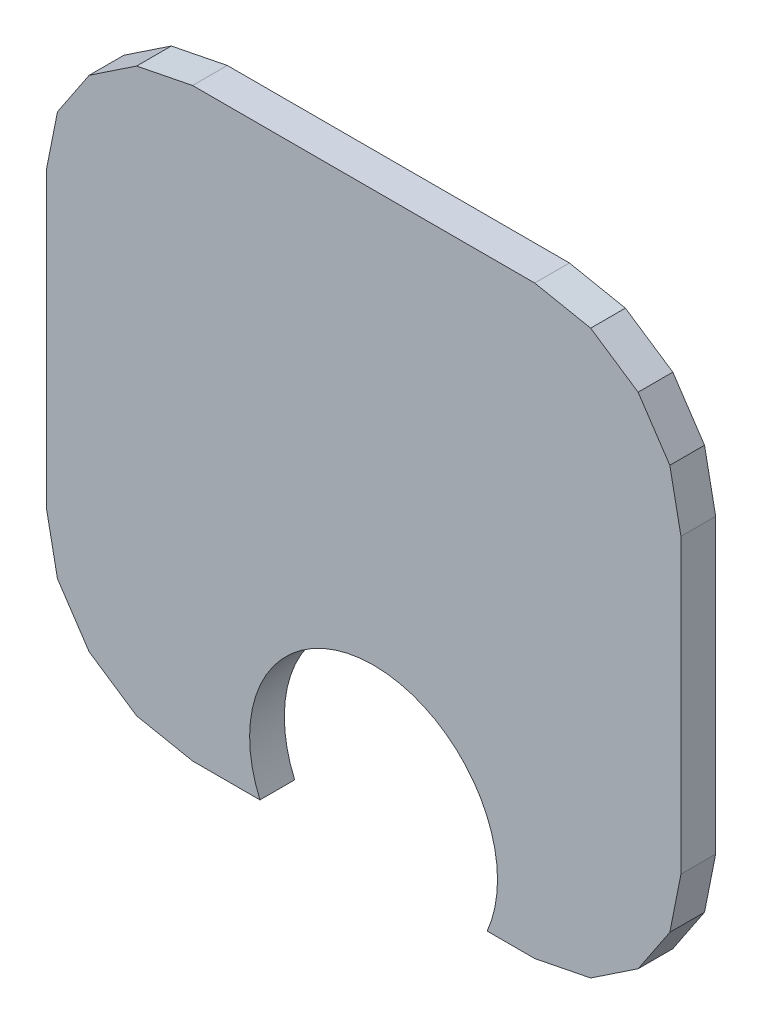
ISO-10303-21;
HEADER;
FILE_DESCRIPTION(('STEP AP214'),'2;1');
FILE_NAME('part.step','',(''),(''),'','','');
FILE_SCHEMA(('AUTOMOTIVE_DESIGN { 1 0 10303 214 1 1 1 1 }'));
ENDSEC;
DATA;
#1=APPLICATION_CONTEXT('core data for automotive mechanical design processes');
#2=APPLICATION_PROTOCOL_DEFINITION('international standard','automotive_design',2000,#1);
#3=PRODUCT_CONTEXT('',#1,'mechanical');
#4=PRODUCT('Part','Part','',(#3));
#5=PRODUCT_RELATED_PRODUCT_CATEGORY('part','',(#4));
#6=PRODUCT_DEFINITION_FORMATION('','',#4);
#7=PRODUCT_DEFINITION_CONTEXT('part definition',#1,'design');
#8=PRODUCT_DEFINITION('design','',#6,#7);
#9=PRODUCT_DEFINITION_SHAPE('','',#8);
#10=(LENGTH_UNIT() NAMED_UNIT(*) SI_UNIT(.MILLI.,.METRE.));
#11=(NAMED_UNIT(*) PLANE_ANGLE_UNIT() SI_UNIT($,.RADIAN.));
#12=(NAMED_UNIT(*) SI_UNIT($,.STERADIAN.) SOLID_ANGLE_UNIT());
#13=UNCERTAINTY_MEASURE_WITH_UNIT(LENGTH_MEASURE(1.E-05),#10,'distance_accuracy_value','');
#14=(GEOMETRIC_REPRESENTATION_CONTEXT(3) GLOBAL_UNCERTAINTY_ASSIGNED_CONTEXT((#13)) GLOBAL_UNIT_ASSIGNED_CONTEXT((#10,
#11,#12)) REPRESENTATION_CONTEXT('',''));
#15=CARTESIAN_POINT('',(0.,0.,0.));
#16=DIRECTION('',(0.,0.,1.));
#17=DIRECTION('',(1.,0.,0.));
#18=AXIS2_PLACEMENT_3D('',#15,#16,#17);
#19=CARTESIAN_POINT('',(144.66,-117.3575,1.6));
#20=DIRECTION('',(1.,0.,0.));
#21=DIRECTION('',(0.,1.,0.));
#22=AXIS2_PLACEMENT_3D('',#19,#20,#21);
#23=PLANE('',#22);
#24=DIRECTION('',(0.,0.,1.));
#25=VECTOR('',#24,1.);
#26=CARTESIAN_POINT('',(144.66,-117.3575,1.6));
#27=LINE('',#26,#25);
#28=CARTESIAN_POINT('',(144.66,-117.3575,1.6));
#29=VERTEX_POINT('',#28);
#30=CARTESIAN_POINT('',(144.66,-117.3575,1.635));
#31=VERTEX_POINT('',#30);
#32=EDGE_CURVE('E37',#29,#31,#27,.T.);
#33=ORIENTED_EDGE('',*,*,#32,.T.);
#34=DIRECTION('',(0.,-1.,0.));
#35=VECTOR('',#34,1.);
#36=CARTESIAN_POINT('',(144.66,-117.3575,1.635));
#37=LINE('',#36,#35);
#38=CARTESIAN_POINT('',(144.66,-117.6525,1.635));
#39=VERTEX_POINT('',#38);
#40=EDGE_CURVE('E171',#31,#39,#37,.T.);
#41=ORIENTED_EDGE('',*,*,#40,.T.);
#42=DIRECTION('',(0.,0.,1.));
#43=VECTOR('',#42,1.);
#44=CARTESIAN_POINT('',(144.66,-117.6525,1.6));
#45=LINE('',#44,#43);
#46=CARTESIAN_POINT('',(144.66,-117.6525,1.6));
#47=VERTEX_POINT('',#46);
#48=EDGE_CURVE('E11',#47,#39,#45,.T.);
#49=ORIENTED_EDGE('',*,*,#48,.F.);
#50=DIRECTION('',(0.,-1.,0.));
#51=VECTOR('',#50,1.);
#52=CARTESIAN_POINT('',(144.66,-117.3575,1.6));
#53=LINE('',#52,#51);
#54=EDGE_CURVE('E449',#29,#47,#53,.T.);
#55=ORIENTED_EDGE('',*,*,#54,.F.);
#56=EDGE_LOOP('',(#33,#41,#49,#55));
#57=FACE_BOUND('',#56,.T.);
#58=ADVANCED_FACE('F17',(#57),#23,.T.);
#59=CARTESIAN_POINT('',(144.66,-117.6525,1.6));
#60=DIRECTION('',(0.980784640360412,-0.195093539701082,0.));
#61=DIRECTION('',(0.,0.,-1.));
#62=AXIS2_PLACEMENT_3D('',#59,#60,#61);
#63=PLANE('',#62);
#64=ORIENTED_EDGE('',*,*,#48,.T.);
#65=DIRECTION('',(-0.195093539701082,-0.980784640360412,0.));
#66=VECTOR('',#65,1.);
#67=CARTESIAN_POINT('',(144.66,-117.6525,1.635));
#68=LINE('',#67,#66);
#69=CARTESIAN_POINT('',(144.648772,-117.708946,1.635));
#70=VERTEX_POINT('',#69);
#71=EDGE_CURVE('E115',#39,#70,#68,.T.);
#72=ORIENTED_EDGE('',*,*,#71,.T.);
#73=DIRECTION('',(0.,0.,1.));
#74=VECTOR('',#73,1.);
#75=CARTESIAN_POINT('',(144.648772,-117.708946,1.6));
#76=LINE('',#75,#74);
#77=CARTESIAN_POINT('',(144.648772,-117.708946,1.6));
#78=VERTEX_POINT('',#77);
#79=EDGE_CURVE('E25',#78,#70,#76,.T.);
#80=ORIENTED_EDGE('',*,*,#79,.F.);
#81=DIRECTION('',(-0.195093539701082,-0.980784640360412,0.));
#82=VECTOR('',#81,1.);
#83=CARTESIAN_POINT('',(144.66,-117.6525,1.6));
#84=LINE('',#83,#82);
#85=EDGE_CURVE('E459',#47,#78,#84,.T.);
#86=ORIENTED_EDGE('',*,*,#85,.F.);
#87=EDGE_LOOP('',(#64,#72,#80,#86));
#88=FACE_BOUND('',#87,.T.);
#89=ADVANCED_FACE('F561',(#88),#63,.T.);
#90=CARTESIAN_POINT('',(144.648772,-117.708946,1.6));
#91=DIRECTION('',(0.831467077354216,-0.555574026819144,0.));
#92=DIRECTION('',(0.,0.,-1.));
#93=AXIS2_PLACEMENT_3D('',#90,#91,#92);
#94=PLANE('',#93);
#95=ORIENTED_EDGE('',*,*,#79,.T.);
#96=DIRECTION('',(-0.555574026819144,-0.831467077354216,0.));
#97=VECTOR('',#96,1.);
#98=CARTESIAN_POINT('',(144.648772,-117.708946,1.635));
#99=LINE('',#98,#97);
#100=CARTESIAN_POINT('',(144.616798,-117.756798,1.635));
#101=VERTEX_POINT('',#100);
#102=EDGE_CURVE('E109',#70,#101,#99,.T.);
#103=ORIENTED_EDGE('',*,*,#102,.T.);
#104=DIRECTION('',(0.,0.,1.));
#105=VECTOR('',#104,1.);
#106=CARTESIAN_POINT('',(144.616798,-117.756798,1.6));
#107=LINE('',#106,#105);
#108=CARTESIAN_POINT('',(144.616798,-117.756798,1.6));
#109=VERTEX_POINT('',#108);
#110=EDGE_CURVE('E92',#109,#101,#107,.T.);
#111=ORIENTED_EDGE('',*,*,#110,.F.);
#112=DIRECTION('',(-0.555574026819144,-0.831467077354216,0.));
#113=VECTOR('',#112,1.);
#114=CARTESIAN_POINT('',(144.648772,-117.708946,1.6));
#115=LINE('',#114,#113);
#116=EDGE_CURVE('E465',#78,#109,#115,.T.);
#117=ORIENTED_EDGE('',*,*,#116,.F.);
#118=EDGE_LOOP('',(#95,#103,#111,#117));
#119=FACE_BOUND('',#118,.T.);
#120=ADVANCED_FACE('F110',(#119),#94,.T.);
#121=CARTESIAN_POINT('',(144.616798,-117.756798,1.6));
#122=DIRECTION('',(0.555574026819144,-0.831467077354216,0.));
#123=DIRECTION('',(0.,0.,-1.));
#124=AXIS2_PLACEMENT_3D('',#121,#122,#123);
#125=PLANE('',#124);
#126=ORIENTED_EDGE('',*,*,#110,.T.);
#127=DIRECTION('',(-0.831467077354216,-0.555574026819144,0.));
#128=VECTOR('',#127,1.);
#129=CARTESIAN_POINT('',(144.616798,-117.756798,1.635));
#130=LINE('',#129,#128);
#131=CARTESIAN_POINT('',(144.568946,-117.788772,1.635));
#132=VERTEX_POINT('',#131);
#133=EDGE_CURVE('E97',#101,#132,#130,.T.);
#134=ORIENTED_EDGE('',*,*,#133,.T.);
#135=DIRECTION('',(0.,0.,1.));
#136=VECTOR('',#135,1.);
#137=CARTESIAN_POINT('',(144.568946,-117.788772,1.6));
#138=LINE('',#137,#136);
#139=CARTESIAN_POINT('',(144.568946,-117.788772,1.6));
#140=VERTEX_POINT('',#139);
#141=EDGE_CURVE('E106',#140,#132,#138,.T.);
#142=ORIENTED_EDGE('',*,*,#141,.F.);
#143=DIRECTION('',(-0.831467077354216,-0.555574026819144,0.));
#144=VECTOR('',#143,1.);
#145=CARTESIAN_POINT('',(144.616798,-117.756798,1.6));
#146=LINE('',#145,#144);
#147=EDGE_CURVE('E101',#109,#140,#146,.T.);
#148=ORIENTED_EDGE('',*,*,#147,.F.);
#149=EDGE_LOOP('',(#126,#134,#142,#148));
#150=FACE_BOUND('',#149,.T.);
#151=ADVANCED_FACE('F94',(#150),#125,.T.);
#152=CARTESIAN_POINT('',(144.568946,-117.788772,1.6));
#153=DIRECTION('',(0.195093539701082,-0.980784640360412,0.));
#154=DIRECTION('',(0.,0.,-1.));
#155=AXIS2_PLACEMENT_3D('',#152,#153,#154);
#156=PLANE('',#155);
#157=ORIENTED_EDGE('',*,*,#141,.T.);
#158=DIRECTION('',(-0.980784640360412,-0.195093539701082,0.));
#159=VECTOR('',#158,1.);
#160=CARTESIAN_POINT('',(144.568946,-117.788772,1.635));
#161=LINE('',#160,#159);
#162=CARTESIAN_POINT('',(144.5125,-117.8,1.635));
#163=VERTEX_POINT('',#162);
#164=EDGE_CURVE('E121',#132,#163,#161,.T.);
#165=ORIENTED_EDGE('',*,*,#164,.T.);
#166=DIRECTION('',(0.,0.,1.));
#167=VECTOR('',#166,1.);
#168=CARTESIAN_POINT('',(144.5125,-117.8,1.6));
#169=LINE('',#168,#167);
#170=CARTESIAN_POINT('',(144.5125,-117.8,1.6));
#171=VERTEX_POINT('',#170);
#172=EDGE_CURVE('E184',#171,#163,#169,.T.);
#173=ORIENTED_EDGE('',*,*,#172,.F.);
#174=DIRECTION('',(-0.980784640360412,-0.195093539701082,0.));
#175=VECTOR('',#174,1.);
#176=CARTESIAN_POINT('',(144.568946,-117.788772,1.6));
#177=LINE('',#176,#175);
#178=EDGE_CURVE('E277',#140,#171,#177,.T.);
#179=ORIENTED_EDGE('',*,*,#178,.F.);
#180=EDGE_LOOP('',(#157,#165,#173,#179));
#181=FACE_BOUND('',#180,.T.);
#182=ADVANCED_FACE('F273',(#181),#156,.T.);
#183=CARTESIAN_POINT('',(144.5125,-117.8,1.6));
#184=DIRECTION('',(0.,-1.,0.));
#185=DIRECTION('',(0.,0.,-1.));
#186=AXIS2_PLACEMENT_3D('',#183,#184,#185);
#187=PLANE('',#186);
#188=DIRECTION('',(-1.,0.,0.));
#189=VECTOR('',#188,1.);
#190=CARTESIAN_POINT('',(144.5125,-117.8,1.6));
#191=LINE('',#190,#189);
#192=CARTESIAN_POINT('',(144.46456439233,-117.8,1.6));
#193=VERTEX_POINT('',#192);
#194=EDGE_CURVE('E468',#171,#193,#191,.T.);
#195=ORIENTED_EDGE('',*,*,#194,.F.);
#196=ORIENTED_EDGE('',*,*,#172,.T.);
#197=DIRECTION('',(-1.,0.,0.));
#198=VECTOR('',#197,1.);
#199=CARTESIAN_POINT('',(144.5125,-117.8,1.635));
#200=LINE('',#199,#198);
#201=CARTESIAN_POINT('',(144.46456439233,-117.8,1.635));
#202=VERTEX_POINT('',#201);
#203=EDGE_CURVE('E128',#163,#202,#200,.T.);
#204=ORIENTED_EDGE('',*,*,#203,.T.);
#205=DIRECTION('',(0.,0.,-1.));
#206=VECTOR('',#205,1.);
#207=CARTESIAN_POINT('',(144.46456439237,-117.8,-0.045));
#208=LINE('',#207,#206);
#209=EDGE_CURVE('E180',#202,#193,#208,.T.);
#210=ORIENTED_EDGE('',*,*,#209,.T.);
#211=EDGE_LOOP('',(#195,#196,#204,#210));
#212=FACE_BOUND('',#211,.T.);
#213=ADVANCED_FACE('F576',(#212),#187,.T.);
#214=CARTESIAN_POINT('',(144.35,-117.75,-0.045));
#215=DIRECTION('',(0.,0.,-1.));
#216=DIRECTION('',(0.,-1.,0.));
#217=AXIS2_PLACEMENT_3D('',#214,#215,#216);
#218=CYLINDRICAL_SURFACE('',#217,0.125);
#219=ORIENTED_EDGE('',*,*,#209,.F.);
#220=CARTESIAN_POINT('',(144.35,-117.75,1.635));
#221=DIRECTION('',(0.,0.,-1.));
#222=DIRECTION('',(0.,-1.,0.));
#223=AXIS2_PLACEMENT_3D('',#220,#221,#222);
#224=CIRCLE('',#223,0.125);
#225=CARTESIAN_POINT('',(144.23543560766,-117.8,1.635));
#226=VERTEX_POINT('',#225);
#227=EDGE_CURVE('E221',#226,#202,#224,.T.);
#228=ORIENTED_EDGE('',*,*,#227,.F.);
#229=DIRECTION('',(0.,0.,-1.));
#230=VECTOR('',#229,1.);
#231=CARTESIAN_POINT('',(144.23543560762,-117.8,-0.045));
#232=LINE('',#231,#230);
#233=CARTESIAN_POINT('',(144.23543560766,-117.8,1.6));
#234=VERTEX_POINT('',#233);
#235=EDGE_CURVE('E185',#226,#234,#232,.T.);
#236=ORIENTED_EDGE('',*,*,#235,.T.);
#237=CARTESIAN_POINT('',(144.35,-117.75,1.6));
#238=DIRECTION('',(0.,0.,-1.));
#239=DIRECTION('',(0.,-1.,0.));
#240=AXIS2_PLACEMENT_3D('',#237,#238,#239);
#241=CIRCLE('',#240,0.125);
#242=EDGE_CURVE('E472',#234,#193,#241,.T.);
#243=ORIENTED_EDGE('',*,*,#242,.T.);
#244=EDGE_LOOP('',(#219,#228,#236,#243));
#245=FACE_BOUND('',#244,.T.);
#246=ADVANCED_FACE('F417',(#245),#218,.F.);
#247=CARTESIAN_POINT('',(144.5125,-117.8,1.6));
#248=DIRECTION('',(0.,-1.,0.));
#249=DIRECTION('',(0.,0.,-1.));
#250=AXIS2_PLACEMENT_3D('',#247,#248,#249);
#251=PLANE('',#250);
#252=DIRECTION('',(-1.,0.,0.));
#253=VECTOR('',#252,1.);
#254=CARTESIAN_POINT('',(144.5125,-117.8,1.6));
#255=LINE('',#254,#253);
#256=CARTESIAN_POINT('',(144.1675,-117.8,1.6));
#257=VERTEX_POINT('',#256);
#258=EDGE_CURVE('E413',#234,#257,#255,.T.);
#259=ORIENTED_EDGE('',*,*,#258,.F.);
#260=ORIENTED_EDGE('',*,*,#235,.F.);
#261=DIRECTION('',(-1.,0.,0.));
#262=VECTOR('',#261,1.);
#263=CARTESIAN_POINT('',(144.5125,-117.8,1.635));
#264=LINE('',#263,#262);
#265=CARTESIAN_POINT('',(144.1675,-117.8,1.635));
#266=VERTEX_POINT('',#265);
#267=EDGE_CURVE('E217',#226,#266,#264,.T.);
#268=ORIENTED_EDGE('',*,*,#267,.T.);
#269=DIRECTION('',(0.,0.,1.));
#270=VECTOR('',#269,1.);
#271=CARTESIAN_POINT('',(144.1675,-117.8,1.6));
#272=LINE('',#271,#270);
#273=EDGE_CURVE('E155',#257,#266,#272,.T.);
#274=ORIENTED_EDGE('',*,*,#273,.F.);
#275=EDGE_LOOP('',(#259,#260,#268,#274));
#276=FACE_BOUND('',#275,.T.);
#277=ADVANCED_FACE('F411',(#276),#251,.T.);
#278=CARTESIAN_POINT('',(144.1675,-117.8,1.6));
#279=DIRECTION('',(-0.195093539701082,-0.980784640360412,0.));
#280=DIRECTION('',(-0.980784640360412,0.195093539701082,0.));
#281=AXIS2_PLACEMENT_3D('',#278,#279,#280);
#282=PLANE('',#281);
#283=ORIENTED_EDGE('',*,*,#273,.T.);
#284=DIRECTION('',(-0.980784640360412,0.195093539701082,0.));
#285=VECTOR('',#284,1.);
#286=CARTESIAN_POINT('',(144.1675,-117.8,1.635));
#287=LINE('',#286,#285);
#288=CARTESIAN_POINT('',(144.111054,-117.788772,1.635));
#289=VERTEX_POINT('',#288);
#290=EDGE_CURVE('E213',#266,#289,#287,.T.);
#291=ORIENTED_EDGE('',*,*,#290,.T.);
#292=DIRECTION('',(0.,0.,1.));
#293=VECTOR('',#292,1.);
#294=CARTESIAN_POINT('',(144.111054,-117.788772,1.6));
#295=LINE('',#294,#293);
#296=CARTESIAN_POINT('',(144.111054,-117.788772,1.6));
#297=VERTEX_POINT('',#296);
#298=EDGE_CURVE('E152',#297,#289,#295,.T.);
#299=ORIENTED_EDGE('',*,*,#298,.F.);
#300=DIRECTION('',(-0.980784640360412,0.195093539701082,0.));
#301=VECTOR('',#300,1.);
#302=CARTESIAN_POINT('',(144.1675,-117.8,1.6));
#303=LINE('',#302,#301);
#304=EDGE_CURVE('E132',#257,#297,#303,.T.);
#305=ORIENTED_EDGE('',*,*,#304,.F.);
#306=EDGE_LOOP('',(#283,#291,#299,#305));
#307=FACE_BOUND('',#306,.T.);
#308=ADVANCED_FACE('F405',(#307),#282,.T.);
#309=CARTESIAN_POINT('',(144.111054,-117.788772,1.6));
#310=DIRECTION('',(-0.555574026818682,-0.831467077354524,0.));
#311=DIRECTION('',(-0.831467077354524,0.555574026818682,0.));
#312=AXIS2_PLACEMENT_3D('',#309,#310,#311);
#313=PLANE('',#312);
#314=ORIENTED_EDGE('',*,*,#298,.T.);
#315=DIRECTION('',(-0.831467077354524,0.555574026818682,0.));
#316=VECTOR('',#315,1.);
#317=CARTESIAN_POINT('',(144.111054,-117.788772,1.635));
#318=LINE('',#317,#316);
#319=CARTESIAN_POINT('',(144.063202,-117.756798,1.635));
#320=VERTEX_POINT('',#319);
#321=EDGE_CURVE('E209',#289,#320,#318,.T.);
#322=ORIENTED_EDGE('',*,*,#321,.T.);
#323=DIRECTION('',(0.,0.,1.));
#324=VECTOR('',#323,1.);
#325=CARTESIAN_POINT('',(144.063202,-117.756798,1.6));
#326=LINE('',#325,#324);
#327=CARTESIAN_POINT('',(144.063202,-117.756798,1.6));
#328=VERTEX_POINT('',#327);
#329=EDGE_CURVE('E156',#328,#320,#326,.T.);
#330=ORIENTED_EDGE('',*,*,#329,.F.);
#331=DIRECTION('',(-0.831467077354524,0.555574026818682,0.));
#332=VECTOR('',#331,1.);
#333=CARTESIAN_POINT('',(144.111054,-117.788772,1.6));
#334=LINE('',#333,#332);
#335=EDGE_CURVE('E139',#297,#328,#334,.T.);
#336=ORIENTED_EDGE('',*,*,#335,.F.);
#337=EDGE_LOOP('',(#314,#322,#330,#336));
#338=FACE_BOUND('',#337,.T.);
#339=ADVANCED_FACE('F400',(#338),#313,.T.);
#340=CARTESIAN_POINT('',(144.063202,-117.756798,1.6));
#341=DIRECTION('',(-0.831467077354524,-0.555574026818682,0.));
#342=DIRECTION('',(-0.555574026818682,0.831467077354524,0.));
#343=AXIS2_PLACEMENT_3D('',#340,#341,#342);
#344=PLANE('',#343);
#345=ORIENTED_EDGE('',*,*,#329,.T.);
#346=DIRECTION('',(-0.555574026818682,0.831467077354524,0.));
#347=VECTOR('',#346,1.);
#348=CARTESIAN_POINT('',(144.063202,-117.756798,1.635));
#349=LINE('',#348,#347);
#350=CARTESIAN_POINT('',(144.031228,-117.708946,1.635));
#351=VERTEX_POINT('',#350);
#352=EDGE_CURVE('E190',#320,#351,#349,.T.);
#353=ORIENTED_EDGE('',*,*,#352,.T.);
#354=DIRECTION('',(0.,0.,1.));
#355=VECTOR('',#354,1.);
#356=CARTESIAN_POINT('',(144.031228,-117.708946,1.6));
#357=LINE('',#356,#355);
#358=CARTESIAN_POINT('',(144.031228,-117.708946,1.6));
#359=VERTEX_POINT('',#358);
#360=EDGE_CURVE('E255',#359,#351,#357,.T.);
#361=ORIENTED_EDGE('',*,*,#360,.F.);
#362=DIRECTION('',(-0.555574026818682,0.831467077354524,0.));
#363=VECTOR('',#362,1.);
#364=CARTESIAN_POINT('',(144.063202,-117.756798,1.6));
#365=LINE('',#364,#363);
#366=EDGE_CURVE('E143',#328,#359,#365,.T.);
#367=ORIENTED_EDGE('',*,*,#366,.F.);
#368=EDGE_LOOP('',(#345,#353,#361,#367));
#369=FACE_BOUND('',#368,.T.);
#370=ADVANCED_FACE('F397',(#369),#344,.T.);
#371=CARTESIAN_POINT('',(144.031228,-117.708946,1.6));
#372=DIRECTION('',(-0.980784640360412,-0.195093539701082,0.));
#373=DIRECTION('',(-0.195093539701082,0.980784640360412,0.));
#374=AXIS2_PLACEMENT_3D('',#371,#372,#373);
#375=PLANE('',#374);
#376=ORIENTED_EDGE('',*,*,#360,.T.);
#377=DIRECTION('',(-0.195093539701082,0.980784640360412,0.));
#378=VECTOR('',#377,1.);
#379=CARTESIAN_POINT('',(144.031228,-117.708946,1.635));
#380=LINE('',#379,#378);
#381=CARTESIAN_POINT('',(144.02,-117.6525,1.635));
#382=VERTEX_POINT('',#381);
#383=EDGE_CURVE('E186',#351,#382,#380,.T.);
#384=ORIENTED_EDGE('',*,*,#383,.T.);
#385=DIRECTION('',(0.,0.,1.));
#386=VECTOR('',#385,1.);
#387=CARTESIAN_POINT('',(144.02,-117.6525,1.6));
#388=LINE('',#387,#386);
#389=CARTESIAN_POINT('',(144.02,-117.6525,1.6));
#390=VERTEX_POINT('',#389);
#391=EDGE_CURVE('E250',#390,#382,#388,.T.);
#392=ORIENTED_EDGE('',*,*,#391,.F.);
#393=DIRECTION('',(-0.195093539701082,0.980784640360412,0.));
#394=VECTOR('',#393,1.);
#395=CARTESIAN_POINT('',(144.031228,-117.708946,1.6));
#396=LINE('',#395,#394);
#397=EDGE_CURVE('E138',#359,#390,#396,.T.);
#398=ORIENTED_EDGE('',*,*,#397,.F.);
#399=EDGE_LOOP('',(#376,#384,#392,#398));
#400=FACE_BOUND('',#399,.T.);
#401=ADVANCED_FACE('F394',(#400),#375,.T.);
#402=CARTESIAN_POINT('',(144.02,-117.6525,1.6));
#403=DIRECTION('',(-1.,0.,0.));
#404=DIRECTION('',(0.,0.,1.));
#405=AXIS2_PLACEMENT_3D('',#402,#403,#404);
#406=PLANE('',#405);
#407=ORIENTED_EDGE('',*,*,#391,.T.);
#408=DIRECTION('',(0.,1.,0.));
#409=VECTOR('',#408,1.);
#410=CARTESIAN_POINT('',(144.02,-117.6525,1.635));
#411=LINE('',#410,#409);
#412=CARTESIAN_POINT('',(144.02,-117.3575,1.635));
#413=VERTEX_POINT('',#412);
#414=EDGE_CURVE('E191',#382,#413,#411,.T.);
#415=ORIENTED_EDGE('',*,*,#414,.T.);
#416=DIRECTION('',(0.,0.,1.));
#417=VECTOR('',#416,1.);
#418=CARTESIAN_POINT('',(144.02,-117.3575,1.6));
#419=LINE('',#418,#417);
#420=CARTESIAN_POINT('',(144.02,-117.3575,1.6));
#421=VERTEX_POINT('',#420);
#422=EDGE_CURVE('E246',#421,#413,#419,.T.);
#423=ORIENTED_EDGE('',*,*,#422,.F.);
#424=DIRECTION('',(0.,1.,0.));
#425=VECTOR('',#424,1.);
#426=CARTESIAN_POINT('',(144.02,-117.6525,1.6));
#427=LINE('',#426,#425);
#428=EDGE_CURVE('E133',#390,#421,#427,.T.);
#429=ORIENTED_EDGE('',*,*,#428,.F.);
#430=EDGE_LOOP('',(#407,#415,#423,#429));
#431=FACE_BOUND('',#430,.T.);
#432=ADVANCED_FACE('F389',(#431),#406,.T.);
#433=CARTESIAN_POINT('',(144.02,-117.3575,1.6));
#434=DIRECTION('',(-0.980784640360412,0.195093539701082,0.));
#435=DIRECTION('',(0.,0.,1.));
#436=AXIS2_PLACEMENT_3D('',#433,#434,#435);
#437=PLANE('',#436);
#438=ORIENTED_EDGE('',*,*,#422,.T.);
#439=DIRECTION('',(0.195093539701082,0.980784640360412,0.));
#440=VECTOR('',#439,1.);
#441=CARTESIAN_POINT('',(144.02,-117.3575,1.635));
#442=LINE('',#441,#440);
#443=CARTESIAN_POINT('',(144.031228,-117.301054,1.635));
#444=VERTEX_POINT('',#443);
#445=EDGE_CURVE('E199',#413,#444,#442,.T.);
#446=ORIENTED_EDGE('',*,*,#445,.T.);
#447=DIRECTION('',(0.,0.,1.));
#448=VECTOR('',#447,1.);
#449=CARTESIAN_POINT('',(144.031228,-117.301054,1.6));
#450=LINE('',#449,#448);
#451=CARTESIAN_POINT('',(144.031228,-117.301054,1.6));
#452=VERTEX_POINT('',#451);
#453=EDGE_CURVE('E242',#452,#444,#450,.T.);
#454=ORIENTED_EDGE('',*,*,#453,.F.);
#455=DIRECTION('',(0.195093539701082,0.980784640360412,0.));
#456=VECTOR('',#455,1.);
#457=CARTESIAN_POINT('',(144.02,-117.3575,1.6));
#458=LINE('',#457,#456);
#459=EDGE_CURVE('E137',#421,#452,#458,.T.);
#460=ORIENTED_EDGE('',*,*,#459,.F.);
#461=EDGE_LOOP('',(#438,#446,#454,#460));
#462=FACE_BOUND('',#461,.T.);
#463=ADVANCED_FACE('F373',(#462),#437,.T.);
#464=CARTESIAN_POINT('',(144.031228,-117.301054,1.6));
#465=DIRECTION('',(-0.831467077354216,0.555574026819144,0.));
#466=DIRECTION('',(0.,0.,1.));
#467=AXIS2_PLACEMENT_3D('',#464,#465,#466);
#468=PLANE('',#467);
#469=ORIENTED_EDGE('',*,*,#453,.T.);
#470=DIRECTION('',(0.555574026819144,0.831467077354216,0.));
#471=VECTOR('',#470,1.);
#472=CARTESIAN_POINT('',(144.031228,-117.301054,1.635));
#473=LINE('',#472,#471);
#474=CARTESIAN_POINT('',(144.063202,-117.253202,1.635));
#475=VERTEX_POINT('',#474);
#476=EDGE_CURVE('E195',#444,#475,#473,.T.);
#477=ORIENTED_EDGE('',*,*,#476,.T.);
#478=DIRECTION('',(0.,0.,1.));
#479=VECTOR('',#478,1.);
#480=CARTESIAN_POINT('',(144.063202,-117.253202,1.6));
#481=LINE('',#480,#479);
#482=CARTESIAN_POINT('',(144.063202,-117.253202,1.6));
#483=VERTEX_POINT('',#482);
#484=EDGE_CURVE('E238',#483,#475,#481,.T.);
#485=ORIENTED_EDGE('',*,*,#484,.F.);
#486=DIRECTION('',(0.555574026819144,0.831467077354216,0.));
#487=VECTOR('',#486,1.);
#488=CARTESIAN_POINT('',(144.031228,-117.301054,1.6));
#489=LINE('',#488,#487);
#490=EDGE_CURVE('E147',#452,#483,#489,.T.);
#491=ORIENTED_EDGE('',*,*,#490,.F.);
#492=EDGE_LOOP('',(#469,#477,#485,#491));
#493=FACE_BOUND('',#492,.T.);
#494=ADVANCED_FACE('F367',(#493),#468,.T.);
#495=CARTESIAN_POINT('',(144.063202,-117.253202,1.6));
#496=DIRECTION('',(-0.555574026819144,0.831467077354216,0.));
#497=DIRECTION('',(0.,0.,1.));
#498=AXIS2_PLACEMENT_3D('',#495,#496,#497);
#499=PLANE('',#498);
#500=ORIENTED_EDGE('',*,*,#484,.T.);
#501=DIRECTION('',(0.831467077354216,0.555574026819144,0.));
#502=VECTOR('',#501,1.);
#503=CARTESIAN_POINT('',(144.063202,-117.253202,1.635));
#504=LINE('',#503,#502);
#505=CARTESIAN_POINT('',(144.111054,-117.221228,1.635));
#506=VERTEX_POINT('',#505);
#507=EDGE_CURVE('E179',#475,#506,#504,.T.);
#508=ORIENTED_EDGE('',*,*,#507,.T.);
#509=DIRECTION('',(0.,0.,1.));
#510=VECTOR('',#509,1.);
#511=CARTESIAN_POINT('',(144.111054,-117.221228,1.6));
#512=LINE('',#511,#510);
#513=CARTESIAN_POINT('',(144.111054,-117.221228,1.6));
#514=VERTEX_POINT('',#513);
#515=EDGE_CURVE('E231',#514,#506,#512,.T.);
#516=ORIENTED_EDGE('',*,*,#515,.F.);
#517=DIRECTION('',(0.831467077354216,0.555574026819144,0.));
#518=VECTOR('',#517,1.);
#519=CARTESIAN_POINT('',(144.063202,-117.253202,1.6));
#520=LINE('',#519,#518);
#521=EDGE_CURVE('E151',#483,#514,#520,.T.);
#522=ORIENTED_EDGE('',*,*,#521,.F.);
#523=EDGE_LOOP('',(#500,#508,#516,#522));
#524=FACE_BOUND('',#523,.T.);
#525=ADVANCED_FACE('F376',(#524),#499,.T.);
#526=CARTESIAN_POINT('',(144.111054,-117.221228,1.6));
#527=DIRECTION('',(-0.195093539701082,0.980784640360412,0.));
#528=DIRECTION('',(0.,0.,1.));
#529=AXIS2_PLACEMENT_3D('',#526,#527,#528);
#530=PLANE('',#529);
#531=ORIENTED_EDGE('',*,*,#515,.T.);
#532=DIRECTION('',(0.980784640360412,0.195093539701082,0.));
#533=VECTOR('',#532,1.);
#534=CARTESIAN_POINT('',(144.111054,-117.221228,1.635));
#535=LINE('',#534,#533);
#536=CARTESIAN_POINT('',(144.1675,-117.21,1.635));
#537=VERTEX_POINT('',#536);
#538=EDGE_CURVE('E175',#506,#537,#535,.T.);
#539=ORIENTED_EDGE('',*,*,#538,.T.);
#540=DIRECTION('',(0.,0.,1.));
#541=VECTOR('',#540,1.);
#542=CARTESIAN_POINT('',(144.1675,-117.21,1.6));
#543=LINE('',#542,#541);
#544=CARTESIAN_POINT('',(144.1675,-117.21,1.6));
#545=VERTEX_POINT('',#544);
#546=EDGE_CURVE('E228',#545,#537,#543,.T.);
#547=ORIENTED_EDGE('',*,*,#546,.F.);
#548=DIRECTION('',(0.980784640360412,0.195093539701082,0.));
#549=VECTOR('',#548,1.);
#550=CARTESIAN_POINT('',(144.111054,-117.221228,1.6));
#551=LINE('',#550,#549);
#552=EDGE_CURVE('E160',#514,#545,#551,.T.);
#553=ORIENTED_EDGE('',*,*,#552,.F.);
#554=EDGE_LOOP('',(#531,#539,#547,#553));
#555=FACE_BOUND('',#554,.T.);
#556=ADVANCED_FACE('F379',(#555),#530,.T.);
#557=CARTESIAN_POINT('',(144.648772,-117.301054,1.6));
#558=DIRECTION('',(0.980784640360412,0.195093539701082,0.));
#559=DIRECTION('',(0.,0.,-1.));
#560=AXIS2_PLACEMENT_3D('',#557,#558,#559);
#561=PLANE('',#560);
#562=DIRECTION('',(0.,0.,1.));
#563=VECTOR('',#562,1.);
#564=CARTESIAN_POINT('',(144.648772,-117.301054,1.6));
#565=LINE('',#564,#563);
#566=CARTESIAN_POINT('',(144.648772,-117.301054,1.6));
#567=VERTEX_POINT('',#566);
#568=CARTESIAN_POINT('',(144.648772,-117.301054,1.635));
#569=VERTEX_POINT('',#568);
#570=EDGE_CURVE('E431',#567,#569,#565,.T.);
#571=ORIENTED_EDGE('',*,*,#570,.T.);
#572=DIRECTION('',(0.195093539701082,-0.980784640360412,0.));
#573=VECTOR('',#572,1.);
#574=CARTESIAN_POINT('',(144.648772,-117.301054,1.635));
#575=LINE('',#574,#573);
#576=EDGE_CURVE('E225',#569,#31,#575,.T.);
#577=ORIENTED_EDGE('',*,*,#576,.T.);
#578=ORIENTED_EDGE('',*,*,#32,.F.);
#579=DIRECTION('',(0.195093539701082,-0.980784640360412,0.));
#580=VECTOR('',#579,1.);
#581=CARTESIAN_POINT('',(144.648772,-117.301054,1.6));
#582=LINE('',#581,#580);
#583=EDGE_CURVE('E445',#567,#29,#582,.T.);
#584=ORIENTED_EDGE('',*,*,#583,.F.);
#585=EDGE_LOOP('',(#571,#577,#578,#584));
#586=FACE_BOUND('',#585,.T.);
#587=ADVANCED_FACE('F548',(#586),#561,.T.);
#588=CARTESIAN_POINT('',(144.1675,-117.21,1.6));
#589=DIRECTION('',(0.,1.,0.));
#590=DIRECTION('',(1.,0.,0.));
#591=AXIS2_PLACEMENT_3D('',#588,#589,#590);
#592=PLANE('',#591);
#593=ORIENTED_EDGE('',*,*,#546,.T.);
#594=DIRECTION('',(1.,0.,0.));
#595=VECTOR('',#594,1.);
#596=CARTESIAN_POINT('',(144.1675,-117.21,1.635));
#597=LINE('',#596,#595);
#598=CARTESIAN_POINT('',(144.5125,-117.21,1.635));
#599=VERTEX_POINT('',#598);
#600=EDGE_CURVE('E168',#537,#599,#597,.T.);
#601=ORIENTED_EDGE('',*,*,#600,.T.);
#602=DIRECTION('',(0.,0.,1.));
#603=VECTOR('',#602,1.);
#604=CARTESIAN_POINT('',(144.5125,-117.21,1.6));
#605=LINE('',#604,#603);
#606=CARTESIAN_POINT('',(144.5125,-117.21,1.6));
#607=VERTEX_POINT('',#606);
#608=EDGE_CURVE('E426',#607,#599,#605,.T.);
#609=ORIENTED_EDGE('',*,*,#608,.F.);
#610=DIRECTION('',(1.,0.,0.));
#611=VECTOR('',#610,1.);
#612=CARTESIAN_POINT('',(144.1675,-117.21,1.6));
#613=LINE('',#612,#611);
#614=EDGE_CURVE('E164',#545,#607,#613,.T.);
#615=ORIENTED_EDGE('',*,*,#614,.F.);
#616=EDGE_LOOP('',(#593,#601,#609,#615));
#617=FACE_BOUND('',#616,.T.);
#618=ADVANCED_FACE('F546',(#617),#592,.T.);
#619=CARTESIAN_POINT('',(144.34,-117.505,1.635));
#620=DIRECTION('',(0.,0.,-1.));
#621=DIRECTION('',(0.,-1.,0.));
#622=AXIS2_PLACEMENT_3D('',#619,#620,#621);
#623=PLANE('',#622);
#624=ORIENTED_EDGE('',*,*,#600,.F.);
#625=ORIENTED_EDGE('',*,*,#538,.F.);
#626=ORIENTED_EDGE('',*,*,#507,.F.);
#627=ORIENTED_EDGE('',*,*,#476,.F.);
#628=ORIENTED_EDGE('',*,*,#445,.F.);
#629=ORIENTED_EDGE('',*,*,#414,.F.);
#630=ORIENTED_EDGE('',*,*,#383,.F.);
#631=ORIENTED_EDGE('',*,*,#352,.F.);
#632=ORIENTED_EDGE('',*,*,#321,.F.);
#633=ORIENTED_EDGE('',*,*,#290,.F.);
#634=ORIENTED_EDGE('',*,*,#267,.F.);
#635=ORIENTED_EDGE('',*,*,#227,.T.);
#636=ORIENTED_EDGE('',*,*,#203,.F.);
#637=ORIENTED_EDGE('',*,*,#164,.F.);
#638=ORIENTED_EDGE('',*,*,#133,.F.);
#639=ORIENTED_EDGE('',*,*,#102,.F.);
#640=ORIENTED_EDGE('',*,*,#71,.F.);
#641=ORIENTED_EDGE('',*,*,#40,.F.);
#642=ORIENTED_EDGE('',*,*,#576,.F.);
#643=DIRECTION('',(0.555574026819144,-0.831467077354216,0.));
#644=VECTOR('',#643,1.);
#645=CARTESIAN_POINT('',(144.616798,-117.253202,1.635));
#646=LINE('',#645,#644);
#647=CARTESIAN_POINT('',(144.616798,-117.253202,1.635));
#648=VERTEX_POINT('',#647);
#649=EDGE_CURVE('E436',#648,#569,#646,.T.);
#650=ORIENTED_EDGE('',*,*,#649,.F.);
#651=DIRECTION('',(0.831467077354216,-0.555574026819144,0.));
#652=VECTOR('',#651,1.);
#653=CARTESIAN_POINT('',(144.568946,-117.221228,1.635));
#654=LINE('',#653,#652);
#655=CARTESIAN_POINT('',(144.568946,-117.221228,1.635));
#656=VERTEX_POINT('',#655);
#657=EDGE_CURVE('E492',#656,#648,#654,.T.);
#658=ORIENTED_EDGE('',*,*,#657,.F.);
#659=DIRECTION('',(0.980784640360412,-0.195093539701082,0.));
#660=VECTOR('',#659,1.);
#661=CARTESIAN_POINT('',(144.5125,-117.21,1.635));
#662=LINE('',#661,#660);
#663=EDGE_CURVE('E430',#599,#656,#662,.T.);
#664=ORIENTED_EDGE('',*,*,#663,.F.);
#665=EDGE_LOOP('',(#624,#625,#626,#627,#628,#629,#630,#631,#632,#633,#634,#635,#636,#637,#638,
#639,#640,#641,#642,#650,#658,#664));
#666=FACE_BOUND('',#665,.T.);
#667=ADVANCED_FACE('F118',(#666),#623,.F.);
#668=CARTESIAN_POINT('',(144.34,-117.505,1.6));
#669=DIRECTION('',(0.,0.,-1.));
#670=DIRECTION('',(0.,-1.,0.));
#671=AXIS2_PLACEMENT_3D('',#668,#669,#670);
#672=PLANE('',#671);
#673=DIRECTION('',(0.980784640360412,-0.195093539701082,0.));
#674=VECTOR('',#673,1.);
#675=CARTESIAN_POINT('',(144.5125,-117.21,1.6));
#676=LINE('',#675,#674);
#677=CARTESIAN_POINT('',(144.568946,-117.221228,1.6));
#678=VERTEX_POINT('',#677);
#679=EDGE_CURVE('E440',#607,#678,#676,.T.);
#680=ORIENTED_EDGE('',*,*,#679,.T.);
#681=DIRECTION('',(0.831467077354216,-0.555574026819144,0.));
#682=VECTOR('',#681,1.);
#683=CARTESIAN_POINT('',(144.568946,-117.221228,1.6));
#684=LINE('',#683,#682);
#685=CARTESIAN_POINT('',(144.616798,-117.253202,1.6));
#686=VERTEX_POINT('',#685);
#687=EDGE_CURVE('E424',#678,#686,#684,.T.);
#688=ORIENTED_EDGE('',*,*,#687,.T.);
#689=DIRECTION('',(0.555574026819144,-0.831467077354216,0.));
#690=VECTOR('',#689,1.);
#691=CARTESIAN_POINT('',(144.616798,-117.253202,1.6));
#692=LINE('',#691,#690);
#693=EDGE_CURVE('E435',#686,#567,#692,.T.);
#694=ORIENTED_EDGE('',*,*,#693,.T.);
#695=ORIENTED_EDGE('',*,*,#583,.T.);
#696=ORIENTED_EDGE('',*,*,#54,.T.);
#697=ORIENTED_EDGE('',*,*,#85,.T.);
#698=ORIENTED_EDGE('',*,*,#116,.T.);
#699=ORIENTED_EDGE('',*,*,#147,.T.);
#700=ORIENTED_EDGE('',*,*,#178,.T.);
#701=ORIENTED_EDGE('',*,*,#194,.T.);
#702=ORIENTED_EDGE('',*,*,#242,.F.);
#703=ORIENTED_EDGE('',*,*,#258,.T.);
#704=ORIENTED_EDGE('',*,*,#304,.T.);
#705=ORIENTED_EDGE('',*,*,#335,.T.);
#706=ORIENTED_EDGE('',*,*,#366,.T.);
#707=ORIENTED_EDGE('',*,*,#397,.T.);
#708=ORIENTED_EDGE('',*,*,#428,.T.);
#709=ORIENTED_EDGE('',*,*,#459,.T.);
#710=ORIENTED_EDGE('',*,*,#490,.T.);
#711=ORIENTED_EDGE('',*,*,#521,.T.);
#712=ORIENTED_EDGE('',*,*,#552,.T.);
#713=ORIENTED_EDGE('',*,*,#614,.T.);
#714=EDGE_LOOP('',(#680,#688,#694,#695,#696,#697,#698,#699,#700,#701,#702,#703,#704,#705,#706,
#707,#708,#709,#710,#711,#712,#713));
#715=FACE_BOUND('',#714,.T.);
#716=ADVANCED_FACE('F383',(#715),#672,.T.);
#717=CARTESIAN_POINT('',(144.616798,-117.253202,1.6));
#718=DIRECTION('',(0.831467077354216,0.555574026819144,0.));
#719=DIRECTION('',(0.,0.,-1.));
#720=AXIS2_PLACEMENT_3D('',#717,#718,#719);
#721=PLANE('',#720);
#722=DIRECTION('',(0.,0.,1.));
#723=VECTOR('',#722,1.);
#724=CARTESIAN_POINT('',(144.616798,-117.253202,1.6));
#725=LINE('',#724,#723);
#726=EDGE_CURVE('E497',#686,#648,#725,.T.);
#727=ORIENTED_EDGE('',*,*,#726,.T.);
#728=ORIENTED_EDGE('',*,*,#649,.T.);
#729=ORIENTED_EDGE('',*,*,#570,.F.);
#730=ORIENTED_EDGE('',*,*,#693,.F.);
#731=EDGE_LOOP('',(#727,#728,#729,#730));
#732=FACE_BOUND('',#731,.T.);
#733=ADVANCED_FACE('F742',(#732),#721,.T.);
#734=CARTESIAN_POINT('',(144.5125,-117.21,1.6));
#735=DIRECTION('',(0.195093539701082,0.980784640360412,0.));
#736=DIRECTION('',(0.,0.,-1.));
#737=AXIS2_PLACEMENT_3D('',#734,#735,#736);
#738=PLANE('',#737);
#739=ORIENTED_EDGE('',*,*,#608,.T.);
#740=ORIENTED_EDGE('',*,*,#663,.T.);
#741=DIRECTION('',(0.,0.,1.));
#742=VECTOR('',#741,1.);
#743=CARTESIAN_POINT('',(144.568946,-117.221228,1.6));
#744=LINE('',#743,#742);
#745=EDGE_CURVE('E488',#678,#656,#744,.T.);
#746=ORIENTED_EDGE('',*,*,#745,.F.);
#747=ORIENTED_EDGE('',*,*,#679,.F.);
#748=EDGE_LOOP('',(#739,#740,#746,#747));
#749=FACE_BOUND('',#748,.T.);
#750=ADVANCED_FACE('F545',(#749),#738,.T.);
#751=CARTESIAN_POINT('',(144.568946,-117.221228,1.6));
#752=DIRECTION('',(0.555574026819144,0.831467077354216,0.));
#753=DIRECTION('',(0.,0.,-1.));
#754=AXIS2_PLACEMENT_3D('',#751,#752,#753);
#755=PLANE('',#754);
#756=ORIENTED_EDGE('',*,*,#745,.T.);
#757=ORIENTED_EDGE('',*,*,#657,.T.);
#758=ORIENTED_EDGE('',*,*,#726,.F.);
#759=ORIENTED_EDGE('',*,*,#687,.F.);
#760=EDGE_LOOP('',(#756,#757,#758,#759));
#761=FACE_BOUND('',#760,.T.);
#762=ADVANCED_FACE('F520',(#761),#755,.T.);
#763=CLOSED_SHELL('',(#58,#89,#120,#151,#182,#213,#246,#277,#308,#339,#370,#401,#432,#463,#494,
#525,#556,#587,#618,#667,#716,#733,#750,#762));
#764=MANIFOLD_SOLID_BREP('B1',#763);
#765=ADVANCED_BREP_SHAPE_REPRESENTATION('',(#18,#764),#14);
#766=SHAPE_DEFINITION_REPRESENTATION(#9,#765);
ENDSEC;
END-ISO-10303-21;
